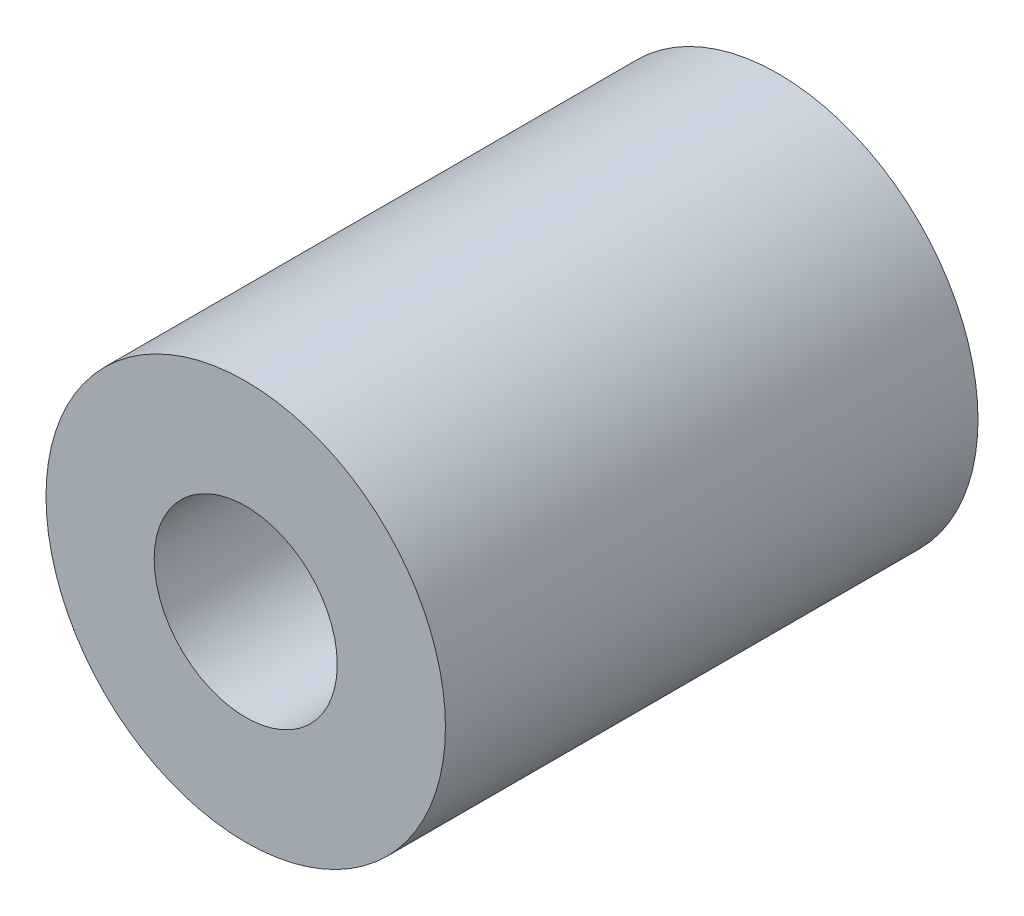
ISO-10303-21;
HEADER;
FILE_DESCRIPTION(('STEP AP214'),'2;1');
FILE_NAME('part.step','',(''),(''),'','','');
FILE_SCHEMA(('AUTOMOTIVE_DESIGN { 1 0 10303 214 1 1 1 1 }'));
ENDSEC;
DATA;
#1=APPLICATION_CONTEXT('core data for automotive mechanical design processes');
#2=APPLICATION_PROTOCOL_DEFINITION('international standard','automotive_design',2000,#1);
#3=PRODUCT_CONTEXT('',#1,'mechanical');
#4=PRODUCT('Part','Part','',(#3));
#5=PRODUCT_RELATED_PRODUCT_CATEGORY('part','',(#4));
#6=PRODUCT_DEFINITION_FORMATION('','',#4);
#7=PRODUCT_DEFINITION_CONTEXT('part definition',#1,'design');
#8=PRODUCT_DEFINITION('design','',#6,#7);
#9=PRODUCT_DEFINITION_SHAPE('','',#8);
#10=(LENGTH_UNIT() NAMED_UNIT(*) SI_UNIT(.MILLI.,.METRE.));
#11=(NAMED_UNIT(*) PLANE_ANGLE_UNIT() SI_UNIT($,.RADIAN.));
#12=(NAMED_UNIT(*) SI_UNIT($,.STERADIAN.) SOLID_ANGLE_UNIT());
#13=UNCERTAINTY_MEASURE_WITH_UNIT(LENGTH_MEASURE(1.E-05),#10,'distance_accuracy_value','');
#14=(GEOMETRIC_REPRESENTATION_CONTEXT(3) GLOBAL_UNCERTAINTY_ASSIGNED_CONTEXT((#13)) GLOBAL_UNIT_ASSIGNED_CONTEXT((#10,
#11,#12)) REPRESENTATION_CONTEXT('',''));
#15=CARTESIAN_POINT('',(0.,0.,0.));
#16=DIRECTION('',(0.,0.,1.));
#17=DIRECTION('',(1.,0.,0.));
#18=AXIS2_PLACEMENT_3D('',#15,#16,#17);
#19=CARTESIAN_POINT('',(0.,0.,8.));
#20=DIRECTION('',(0.,0.,1.));
#21=DIRECTION('',(1.,0.,0.));
#22=AXIS2_PLACEMENT_3D('',#19,#20,#21);
#23=PLANE('',#22);
#24=CARTESIAN_POINT('',(0.,0.,8.));
#25=DIRECTION('',(0.,0.,1.));
#26=DIRECTION('',(1.,0.,0.));
#27=AXIS2_PLACEMENT_3D('',#24,#25,#26);
#28=CIRCLE('',#27,3.);
#29=CARTESIAN_POINT('',(3.,0.,8.));
#30=VERTEX_POINT('',#29);
#31=EDGE_CURVE('E10',#30,#30,#28,.T.);
#32=ORIENTED_EDGE('',*,*,#31,.T.);
#33=EDGE_LOOP('',(#32));
#34=FACE_BOUND('',#33,.T.);
#35=CARTESIAN_POINT('',(0.,0.,8.));
#36=DIRECTION('',(0.,0.,1.));
#37=DIRECTION('',(1.,0.,0.));
#38=AXIS2_PLACEMENT_3D('',#35,#36,#37);
#39=CIRCLE('',#38,1.375);
#40=CARTESIAN_POINT('',(1.375,0.,8.));
#41=VERTEX_POINT('',#40);
#42=EDGE_CURVE('E43',#41,#41,#39,.T.);
#43=ORIENTED_EDGE('',*,*,#42,.F.);
#44=EDGE_LOOP('',(#43));
#45=FACE_BOUND('',#44,.T.);
#46=ADVANCED_FACE('F32',(#34,#45),#23,.T.);
#47=CARTESIAN_POINT('',(0.,0.,0.));
#48=DIRECTION('',(0.,0.,1.));
#49=DIRECTION('',(1.,0.,0.));
#50=AXIS2_PLACEMENT_3D('',#47,#48,#49);
#51=PLANE('',#50);
#52=CARTESIAN_POINT('',(0.,0.,0.));
#53=DIRECTION('',(0.,0.,1.));
#54=DIRECTION('',(1.,0.,0.));
#55=AXIS2_PLACEMENT_3D('',#52,#53,#54);
#56=CIRCLE('',#55,3.);
#57=CARTESIAN_POINT('',(3.,0.,0.));
#58=VERTEX_POINT('',#57);
#59=EDGE_CURVE('E36',#58,#58,#56,.T.);
#60=ORIENTED_EDGE('',*,*,#59,.F.);
#61=EDGE_LOOP('',(#60));
#62=FACE_BOUND('',#61,.T.);
#63=CARTESIAN_POINT('',(0.,0.,0.));
#64=DIRECTION('',(0.,0.,1.));
#65=DIRECTION('',(1.,0.,0.));
#66=AXIS2_PLACEMENT_3D('',#63,#64,#65);
#67=CIRCLE('',#66,1.375);
#68=CARTESIAN_POINT('',(1.375,0.,0.));
#69=VERTEX_POINT('',#68);
#70=EDGE_CURVE('E45',#69,#69,#67,.T.);
#71=ORIENTED_EDGE('',*,*,#70,.T.);
#72=EDGE_LOOP('',(#71));
#73=FACE_BOUND('',#72,.T.);
#74=ADVANCED_FACE('F55',(#62,#73),#51,.F.);
#75=CARTESIAN_POINT('',(0.,0.,8.));
#76=DIRECTION('',(0.,0.,-1.));
#77=DIRECTION('',(-1.,0.,0.));
#78=AXIS2_PLACEMENT_3D('',#75,#76,#77);
#79=CYLINDRICAL_SURFACE('',#78,3.);
#80=ORIENTED_EDGE('',*,*,#31,.F.);
#81=EDGE_LOOP('',(#80));
#82=FACE_BOUND('',#81,.T.);
#83=ORIENTED_EDGE('',*,*,#59,.T.);
#84=EDGE_LOOP('',(#83));
#85=FACE_BOUND('',#84,.T.);
#86=ADVANCED_FACE('F34',(#82,#85),#79,.T.);
#87=CARTESIAN_POINT('',(0.,0.,8.));
#88=DIRECTION('',(0.,0.,-1.));
#89=DIRECTION('',(-1.,0.,0.));
#90=AXIS2_PLACEMENT_3D('',#87,#88,#89);
#91=CYLINDRICAL_SURFACE('',#90,1.375);
#92=ORIENTED_EDGE('',*,*,#42,.T.);
#93=EDGE_LOOP('',(#92));
#94=FACE_BOUND('',#93,.T.);
#95=ORIENTED_EDGE('',*,*,#70,.F.);
#96=EDGE_LOOP('',(#95));
#97=FACE_BOUND('',#96,.T.);
#98=ADVANCED_FACE('F51',(#94,#97),#91,.F.);
#99=CLOSED_SHELL('',(#46,#74,#86,#98));
#100=MANIFOLD_SOLID_BREP('B2',#99);
#101=ADVANCED_BREP_SHAPE_REPRESENTATION('',(#18,#100),#14);
#102=SHAPE_DEFINITION_REPRESENTATION(#9,#101);
ENDSEC;
END-ISO-10303-21;
